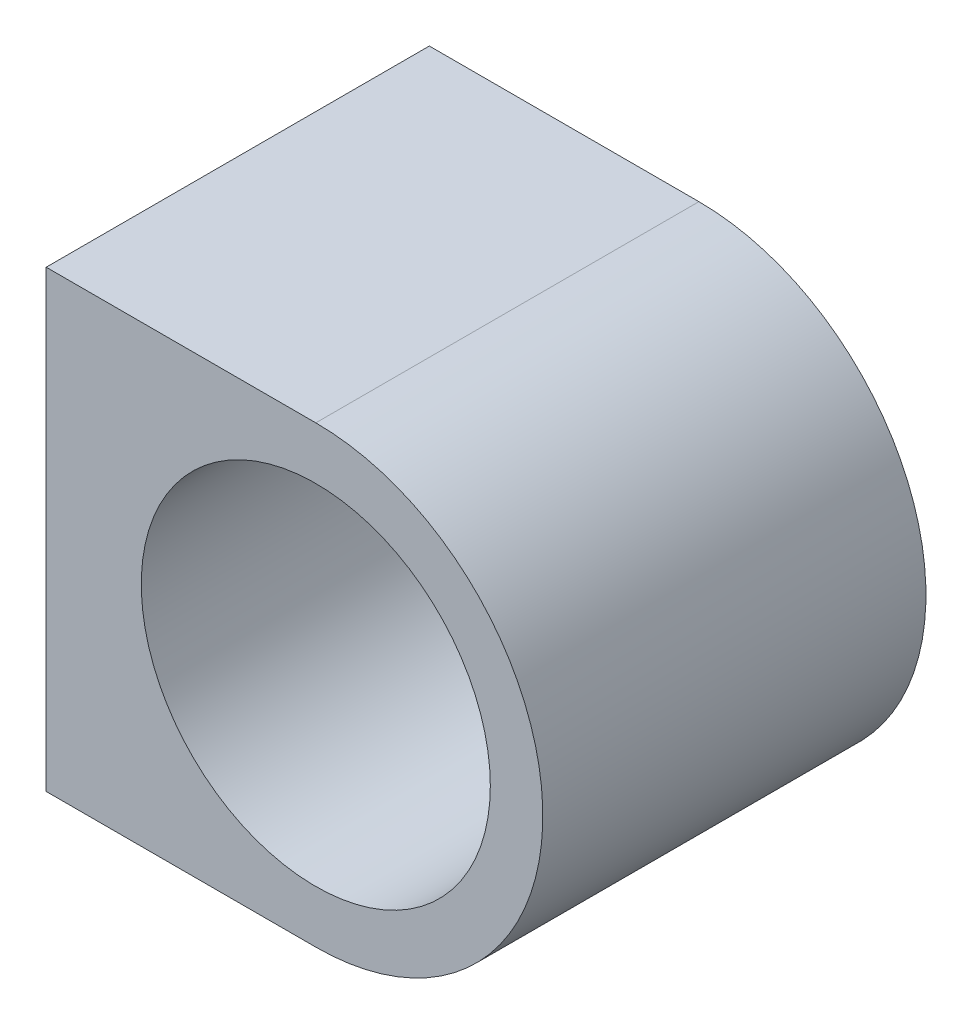
ISO-10303-21;
HEADER;
FILE_DESCRIPTION(('STEP AP214'),'2;1');
FILE_NAME('part.step','',(''),(''),'','','');
FILE_SCHEMA(('AUTOMOTIVE_DESIGN { 1 0 10303 214 1 1 1 1 }'));
ENDSEC;
DATA;
#1=APPLICATION_CONTEXT('core data for automotive mechanical design processes');
#2=APPLICATION_PROTOCOL_DEFINITION('international standard','automotive_design',2000,#1);
#3=PRODUCT_CONTEXT('',#1,'mechanical');
#4=PRODUCT('Part','Part','',(#3));
#5=PRODUCT_RELATED_PRODUCT_CATEGORY('part','',(#4));
#6=PRODUCT_DEFINITION_FORMATION('','',#4);
#7=PRODUCT_DEFINITION_CONTEXT('part definition',#1,'design');
#8=PRODUCT_DEFINITION('design','',#6,#7);
#9=PRODUCT_DEFINITION_SHAPE('','',#8);
#10=(LENGTH_UNIT() NAMED_UNIT(*) SI_UNIT(.MILLI.,.METRE.));
#11=(NAMED_UNIT(*) PLANE_ANGLE_UNIT() SI_UNIT($,.RADIAN.));
#12=(NAMED_UNIT(*) SI_UNIT($,.STERADIAN.) SOLID_ANGLE_UNIT());
#13=UNCERTAINTY_MEASURE_WITH_UNIT(LENGTH_MEASURE(1.E-05),#10,'distance_accuracy_value','');
#14=(GEOMETRIC_REPRESENTATION_CONTEXT(3) GLOBAL_UNCERTAINTY_ASSIGNED_CONTEXT((#13)) GLOBAL_UNIT_ASSIGNED_CONTEXT((#10,
#11,#12)) REPRESENTATION_CONTEXT('',''));
#15=CARTESIAN_POINT('',(0.,0.,0.));
#16=DIRECTION('',(0.,0.,1.));
#17=DIRECTION('',(1.,0.,0.));
#18=AXIS2_PLACEMENT_3D('',#15,#16,#17);
#19=CARTESIAN_POINT('',(0.,0.,13.5));
#20=DIRECTION('',(0.,0.,1.));
#21=DIRECTION('',(1.,0.,0.));
#22=AXIS2_PLACEMENT_3D('',#19,#20,#21);
#23=PLANE('',#22);
#24=CARTESIAN_POINT('',(0.,0.,13.5));
#25=DIRECTION('',(0.,0.,1.));
#26=DIRECTION('',(1.,0.,0.));
#27=AXIS2_PLACEMENT_3D('',#24,#25,#26);
#28=CIRCLE('',#27,8.);
#29=CARTESIAN_POINT('',(0.,-8.,13.5));
#30=VERTEX_POINT('',#29);
#31=CARTESIAN_POINT('',(0.,8.,13.5));
#32=VERTEX_POINT('',#31);
#33=EDGE_CURVE('E131',#30,#32,#28,.T.);
#34=ORIENTED_EDGE('',*,*,#33,.T.);
#35=DIRECTION('',(-1.,0.,0.));
#36=VECTOR('',#35,1.);
#37=CARTESIAN_POINT('',(0.,8.,13.5));
#38=LINE('',#37,#36);
#39=CARTESIAN_POINT('',(-9.5,8.,13.5));
#40=VERTEX_POINT('',#39);
#41=EDGE_CURVE('E78',#32,#40,#38,.T.);
#42=ORIENTED_EDGE('',*,*,#41,.T.);
#43=DIRECTION('',(0.,-1.,0.));
#44=VECTOR('',#43,1.);
#45=CARTESIAN_POINT('',(-9.5,8.,13.5));
#46=LINE('',#45,#44);
#47=CARTESIAN_POINT('',(-9.5,-8.,13.5));
#48=VERTEX_POINT('',#47);
#49=EDGE_CURVE('E134',#40,#48,#46,.T.);
#50=ORIENTED_EDGE('',*,*,#49,.T.);
#51=DIRECTION('',(1.,0.,0.));
#52=VECTOR('',#51,1.);
#53=CARTESIAN_POINT('',(0.,-8.,13.5));
#54=LINE('',#53,#52);
#55=EDGE_CURVE('E47',#48,#30,#54,.T.);
#56=ORIENTED_EDGE('',*,*,#55,.T.);
#57=EDGE_LOOP('',(#34,#42,#50,#56));
#58=FACE_BOUND('',#57,.T.);
#59=CARTESIAN_POINT('',(0.,0.,13.5));
#60=DIRECTION('',(0.,0.,1.));
#61=DIRECTION('',(1.,0.,0.));
#62=AXIS2_PLACEMENT_3D('',#59,#60,#61);
#63=CIRCLE('',#62,6.15);
#64=CARTESIAN_POINT('',(6.15,0.,13.5));
#65=VERTEX_POINT('',#64);
#66=EDGE_CURVE('E125',#65,#65,#63,.T.);
#67=ORIENTED_EDGE('',*,*,#66,.F.);
#68=EDGE_LOOP('',(#67));
#69=FACE_BOUND('',#68,.T.);
#70=ADVANCED_FACE('F30',(#58,#69),#23,.T.);
#71=CARTESIAN_POINT('',(0.,0.,0.));
#72=DIRECTION('',(0.,0.,1.));
#73=DIRECTION('',(1.,0.,0.));
#74=AXIS2_PLACEMENT_3D('',#71,#72,#73);
#75=PLANE('',#74);
#76=CARTESIAN_POINT('',(0.,0.,0.));
#77=DIRECTION('',(0.,0.,1.));
#78=DIRECTION('',(1.,0.,0.));
#79=AXIS2_PLACEMENT_3D('',#76,#77,#78);
#80=CIRCLE('',#79,8.);
#81=CARTESIAN_POINT('',(0.,-8.,0.));
#82=VERTEX_POINT('',#81);
#83=CARTESIAN_POINT('',(0.,8.,0.));
#84=VERTEX_POINT('',#83);
#85=EDGE_CURVE('E128',#82,#84,#80,.T.);
#86=ORIENTED_EDGE('',*,*,#85,.F.);
#87=DIRECTION('',(1.,0.,0.));
#88=VECTOR('',#87,1.);
#89=CARTESIAN_POINT('',(0.,-8.,0.));
#90=LINE('',#89,#88);
#91=CARTESIAN_POINT('',(-9.5,-8.,0.));
#92=VERTEX_POINT('',#91);
#93=EDGE_CURVE('E71',#92,#82,#90,.T.);
#94=ORIENTED_EDGE('',*,*,#93,.F.);
#95=DIRECTION('',(0.,-1.,0.));
#96=VECTOR('',#95,1.);
#97=CARTESIAN_POINT('',(-9.5,8.,0.));
#98=LINE('',#97,#96);
#99=CARTESIAN_POINT('',(-9.5,8.,0.));
#100=VERTEX_POINT('',#99);
#101=EDGE_CURVE('E65',#100,#92,#98,.T.);
#102=ORIENTED_EDGE('',*,*,#101,.F.);
#103=DIRECTION('',(-1.,0.,0.));
#104=VECTOR('',#103,1.);
#105=CARTESIAN_POINT('',(0.,8.,0.));
#106=LINE('',#105,#104);
#107=EDGE_CURVE('E140',#84,#100,#106,.T.);
#108=ORIENTED_EDGE('',*,*,#107,.F.);
#109=EDGE_LOOP('',(#86,#94,#102,#108));
#110=FACE_BOUND('',#109,.T.);
#111=CARTESIAN_POINT('',(0.,0.,0.));
#112=DIRECTION('',(0.,0.,1.));
#113=DIRECTION('',(1.,0.,0.));
#114=AXIS2_PLACEMENT_3D('',#111,#112,#113);
#115=CIRCLE('',#114,6.15);
#116=CARTESIAN_POINT('',(6.15,0.,0.));
#117=VERTEX_POINT('',#116);
#118=EDGE_CURVE('E124',#117,#117,#115,.T.);
#119=ORIENTED_EDGE('',*,*,#118,.T.);
#120=EDGE_LOOP('',(#119));
#121=FACE_BOUND('',#120,.T.);
#122=ADVANCED_FACE('F150',(#110,#121),#75,.F.);
#123=CARTESIAN_POINT('',(0.,0.,13.5));
#124=DIRECTION('',(0.,0.,-1.));
#125=DIRECTION('',(-1.,0.,0.));
#126=AXIS2_PLACEMENT_3D('',#123,#124,#125);
#127=CYLINDRICAL_SURFACE('',#126,8.);
#128=ORIENTED_EDGE('',*,*,#85,.T.);
#129=DIRECTION('',(0.,0.,-1.));
#130=VECTOR('',#129,1.);
#131=CARTESIAN_POINT('',(0.,8.,13.5));
#132=LINE('',#131,#130);
#133=EDGE_CURVE('E11',#32,#84,#132,.T.);
#134=ORIENTED_EDGE('',*,*,#133,.F.);
#135=ORIENTED_EDGE('',*,*,#33,.F.);
#136=DIRECTION('',(0.,0.,-1.));
#137=VECTOR('',#136,1.);
#138=CARTESIAN_POINT('',(0.,-8.,13.5));
#139=LINE('',#138,#137);
#140=EDGE_CURVE('E137',#30,#82,#139,.T.);
#141=ORIENTED_EDGE('',*,*,#140,.T.);
#142=EDGE_LOOP('',(#128,#134,#135,#141));
#143=FACE_BOUND('',#142,.T.);
#144=ADVANCED_FACE('F32',(#143),#127,.T.);
#145=CARTESIAN_POINT('',(0.,8.,13.5));
#146=DIRECTION('',(0.,-1.,0.));
#147=DIRECTION('',(1.,0.,0.));
#148=AXIS2_PLACEMENT_3D('',#145,#146,#147);
#149=PLANE('',#148);
#150=ORIENTED_EDGE('',*,*,#107,.T.);
#151=DIRECTION('',(0.,0.,-1.));
#152=VECTOR('',#151,1.);
#153=CARTESIAN_POINT('',(-9.5,8.,13.5));
#154=LINE('',#153,#152);
#155=EDGE_CURVE('E39',#40,#100,#154,.T.);
#156=ORIENTED_EDGE('',*,*,#155,.F.);
#157=ORIENTED_EDGE('',*,*,#41,.F.);
#158=ORIENTED_EDGE('',*,*,#133,.T.);
#159=EDGE_LOOP('',(#150,#156,#157,#158));
#160=FACE_BOUND('',#159,.T.);
#161=ADVANCED_FACE('F166',(#160),#149,.F.);
#162=CARTESIAN_POINT('',(-9.5,8.,13.5));
#163=DIRECTION('',(1.,0.,0.));
#164=DIRECTION('',(0.,0.,-1.));
#165=AXIS2_PLACEMENT_3D('',#162,#163,#164);
#166=PLANE('',#165);
#167=CARTESIAN_POINT('',(-9.5,-5.,2.5));
#168=DIRECTION('',(-1.,0.,0.));
#169=DIRECTION('',(0.,0.,1.));
#170=AXIS2_PLACEMENT_3D('',#167,#168,#169);
#171=CIRCLE('',#170,1.35);
#172=CARTESIAN_POINT('',(-9.5,-5.,3.85));
#173=VERTEX_POINT('',#172);
#174=EDGE_CURVE('E102',#173,#173,#171,.T.);
#175=ORIENTED_EDGE('',*,*,#174,.F.);
#176=EDGE_LOOP('',(#175));
#177=FACE_BOUND('',#176,.T.);
#178=CARTESIAN_POINT('',(-9.5,5.,2.5));
#179=DIRECTION('',(-1.,0.,0.));
#180=DIRECTION('',(0.,0.,1.));
#181=AXIS2_PLACEMENT_3D('',#178,#179,#180);
#182=CIRCLE('',#181,1.35);
#183=CARTESIAN_POINT('',(-9.5,5.,3.85));
#184=VERTEX_POINT('',#183);
#185=EDGE_CURVE('E101',#184,#184,#182,.T.);
#186=ORIENTED_EDGE('',*,*,#185,.F.);
#187=EDGE_LOOP('',(#186));
#188=FACE_BOUND('',#187,.T.);
#189=CARTESIAN_POINT('',(-9.5,5.,11.));
#190=DIRECTION('',(-1.,0.,0.));
#191=DIRECTION('',(0.,0.,1.));
#192=AXIS2_PLACEMENT_3D('',#189,#190,#191);
#193=CIRCLE('',#192,1.35);
#194=CARTESIAN_POINT('',(-9.5,5.,12.35));
#195=VERTEX_POINT('',#194);
#196=EDGE_CURVE('E112',#195,#195,#193,.T.);
#197=ORIENTED_EDGE('',*,*,#196,.F.);
#198=EDGE_LOOP('',(#197));
#199=FACE_BOUND('',#198,.T.);
#200=CARTESIAN_POINT('',(-9.5,-5.,11.));
#201=DIRECTION('',(-1.,0.,0.));
#202=DIRECTION('',(0.,0.,1.));
#203=AXIS2_PLACEMENT_3D('',#200,#201,#202);
#204=CIRCLE('',#203,1.35);
#205=CARTESIAN_POINT('',(-9.5,-5.,12.35));
#206=VERTEX_POINT('',#205);
#207=EDGE_CURVE('E118',#206,#206,#204,.T.);
#208=ORIENTED_EDGE('',*,*,#207,.F.);
#209=EDGE_LOOP('',(#208));
#210=FACE_BOUND('',#209,.T.);
#211=ORIENTED_EDGE('',*,*,#101,.T.);
#212=DIRECTION('',(0.,0.,-1.));
#213=VECTOR('',#212,1.);
#214=CARTESIAN_POINT('',(-9.5,-8.,13.5));
#215=LINE('',#214,#213);
#216=EDGE_CURVE('E145',#48,#92,#215,.T.);
#217=ORIENTED_EDGE('',*,*,#216,.F.);
#218=ORIENTED_EDGE('',*,*,#49,.F.);
#219=ORIENTED_EDGE('',*,*,#155,.T.);
#220=EDGE_LOOP('',(#211,#217,#218,#219));
#221=FACE_BOUND('',#220,.T.);
#222=ADVANCED_FACE('F147',(#177,#188,#199,#210,#221),#166,.F.);
#223=CARTESIAN_POINT('',(0.,-8.,13.5));
#224=DIRECTION('',(0.,1.,0.));
#225=DIRECTION('',(-1.,0.,0.));
#226=AXIS2_PLACEMENT_3D('',#223,#224,#225);
#227=PLANE('',#226);
#228=ORIENTED_EDGE('',*,*,#93,.T.);
#229=ORIENTED_EDGE('',*,*,#140,.F.);
#230=ORIENTED_EDGE('',*,*,#55,.F.);
#231=ORIENTED_EDGE('',*,*,#216,.T.);
#232=EDGE_LOOP('',(#228,#229,#230,#231));
#233=FACE_BOUND('',#232,.T.);
#234=ADVANCED_FACE('F155',(#233),#227,.F.);
#235=CARTESIAN_POINT('',(0.,0.,13.5));
#236=DIRECTION('',(0.,0.,-1.));
#237=DIRECTION('',(-1.,0.,0.));
#238=AXIS2_PLACEMENT_3D('',#235,#236,#237);
#239=CYLINDRICAL_SURFACE('',#238,6.15);
#240=ORIENTED_EDGE('',*,*,#66,.T.);
#241=EDGE_LOOP('',(#240));
#242=FACE_BOUND('',#241,.T.);
#243=ORIENTED_EDGE('',*,*,#118,.F.);
#244=EDGE_LOOP('',(#243));
#245=FACE_BOUND('',#244,.T.);
#246=ADVANCED_FACE('F157',(#242,#245),#239,.F.);
#247=CARTESIAN_POINT('',(-5.5,-5.,11.));
#248=DIRECTION('',(-1.,0.,0.));
#249=DIRECTION('',(0.,0.,1.));
#250=AXIS2_PLACEMENT_3D('',#247,#248,#249);
#251=CONICAL_SURFACE('',#250,1.35,1.02974425867665);
#252=CARTESIAN_POINT('',(-4.68883816431279,-5.,11.));
#253=VERTEX_POINT('',#252);
#254=VERTEX_LOOP('',#253);
#255=FACE_BOUND('',#254,.T.);
#256=CARTESIAN_POINT('',(-5.5,-5.,11.));
#257=DIRECTION('',(-1.,0.,0.));
#258=DIRECTION('',(0.,0.,1.));
#259=AXIS2_PLACEMENT_3D('',#256,#257,#258);
#260=CIRCLE('',#259,1.35);
#261=CARTESIAN_POINT('',(-5.5,-5.,12.35));
#262=VERTEX_POINT('',#261);
#263=EDGE_CURVE('E121',#262,#262,#260,.T.);
#264=ORIENTED_EDGE('',*,*,#263,.T.);
#265=EDGE_LOOP('',(#264));
#266=FACE_BOUND('',#265,.T.);
#267=ADVANCED_FACE('F163',(#255,#266),#251,.F.);
#268=CARTESIAN_POINT('',(-9.5,-5.,11.));
#269=DIRECTION('',(-1.,0.,0.));
#270=DIRECTION('',(0.,0.,1.));
#271=AXIS2_PLACEMENT_3D('',#268,#269,#270);
#272=CYLINDRICAL_SURFACE('',#271,1.35);
#273=ORIENTED_EDGE('',*,*,#263,.F.);
#274=EDGE_LOOP('',(#273));
#275=FACE_BOUND('',#274,.T.);
#276=ORIENTED_EDGE('',*,*,#207,.T.);
#277=EDGE_LOOP('',(#276));
#278=FACE_BOUND('',#277,.T.);
#279=ADVANCED_FACE('F179',(#275,#278),#272,.F.);
#280=CARTESIAN_POINT('',(-5.5,5.,11.));
#281=DIRECTION('',(-1.,0.,0.));
#282=DIRECTION('',(0.,0.,1.));
#283=AXIS2_PLACEMENT_3D('',#280,#281,#282);
#284=CONICAL_SURFACE('',#283,1.35,1.02974425867665);
#285=CARTESIAN_POINT('',(-4.68883816431279,5.,11.));
#286=VERTEX_POINT('',#285);
#287=VERTEX_LOOP('',#286);
#288=FACE_BOUND('',#287,.T.);
#289=CARTESIAN_POINT('',(-5.5,5.,11.));
#290=DIRECTION('',(-1.,0.,0.));
#291=DIRECTION('',(0.,0.,1.));
#292=AXIS2_PLACEMENT_3D('',#289,#290,#291);
#293=CIRCLE('',#292,1.35);
#294=CARTESIAN_POINT('',(-5.5,5.,12.35));
#295=VERTEX_POINT('',#294);
#296=EDGE_CURVE('E115',#295,#295,#293,.T.);
#297=ORIENTED_EDGE('',*,*,#296,.T.);
#298=EDGE_LOOP('',(#297));
#299=FACE_BOUND('',#298,.T.);
#300=ADVANCED_FACE('F183',(#288,#299),#284,.F.);
#301=CARTESIAN_POINT('',(-9.5,5.,11.));
#302=DIRECTION('',(-1.,0.,0.));
#303=DIRECTION('',(0.,0.,1.));
#304=AXIS2_PLACEMENT_3D('',#301,#302,#303);
#305=CYLINDRICAL_SURFACE('',#304,1.35);
#306=ORIENTED_EDGE('',*,*,#296,.F.);
#307=EDGE_LOOP('',(#306));
#308=FACE_BOUND('',#307,.T.);
#309=ORIENTED_EDGE('',*,*,#196,.T.);
#310=EDGE_LOOP('',(#309));
#311=FACE_BOUND('',#310,.T.);
#312=ADVANCED_FACE('F187',(#308,#311),#305,.F.);
#313=CARTESIAN_POINT('',(-5.5,5.,2.5));
#314=DIRECTION('',(-1.,0.,0.));
#315=DIRECTION('',(0.,0.,1.));
#316=AXIS2_PLACEMENT_3D('',#313,#314,#315);
#317=CONICAL_SURFACE('',#316,1.35,1.02974425867665);
#318=CARTESIAN_POINT('',(-4.68883816431279,5.,2.5));
#319=VERTEX_POINT('',#318);
#320=VERTEX_LOOP('',#319);
#321=FACE_BOUND('',#320,.T.);
#322=CARTESIAN_POINT('',(-5.5,5.,2.5));
#323=DIRECTION('',(-1.,0.,0.));
#324=DIRECTION('',(0.,0.,1.));
#325=AXIS2_PLACEMENT_3D('',#322,#323,#324);
#326=CIRCLE('',#325,1.35);
#327=CARTESIAN_POINT('',(-5.5,5.,3.85));
#328=VERTEX_POINT('',#327);
#329=EDGE_CURVE('E105',#328,#328,#326,.T.);
#330=ORIENTED_EDGE('',*,*,#329,.T.);
#331=EDGE_LOOP('',(#330));
#332=FACE_BOUND('',#331,.T.);
#333=ADVANCED_FACE('F191',(#321,#332),#317,.F.);
#334=CARTESIAN_POINT('',(-9.5,5.,2.5));
#335=DIRECTION('',(-1.,0.,0.));
#336=DIRECTION('',(0.,0.,1.));
#337=AXIS2_PLACEMENT_3D('',#334,#335,#336);
#338=CYLINDRICAL_SURFACE('',#337,1.35);
#339=ORIENTED_EDGE('',*,*,#329,.F.);
#340=EDGE_LOOP('',(#339));
#341=FACE_BOUND('',#340,.T.);
#342=ORIENTED_EDGE('',*,*,#185,.T.);
#343=EDGE_LOOP('',(#342));
#344=FACE_BOUND('',#343,.T.);
#345=ADVANCED_FACE('F95',(#341,#344),#338,.F.);
#346=CARTESIAN_POINT('',(-5.5,-5.,2.5));
#347=DIRECTION('',(-1.,0.,0.));
#348=DIRECTION('',(0.,0.,1.));
#349=AXIS2_PLACEMENT_3D('',#346,#347,#348);
#350=CONICAL_SURFACE('',#349,1.35,1.02974425867665);
#351=CARTESIAN_POINT('',(-4.68883816431279,-5.,2.5));
#352=VERTEX_POINT('',#351);
#353=VERTEX_LOOP('',#352);
#354=FACE_BOUND('',#353,.T.);
#355=CARTESIAN_POINT('',(-5.5,-5.,2.5));
#356=DIRECTION('',(-1.,0.,0.));
#357=DIRECTION('',(0.,0.,1.));
#358=AXIS2_PLACEMENT_3D('',#355,#356,#357);
#359=CIRCLE('',#358,1.35);
#360=CARTESIAN_POINT('',(-5.5,-5.,3.85));
#361=VERTEX_POINT('',#360);
#362=EDGE_CURVE('E99',#361,#361,#359,.T.);
#363=ORIENTED_EDGE('',*,*,#362,.T.);
#364=EDGE_LOOP('',(#363));
#365=FACE_BOUND('',#364,.T.);
#366=ADVANCED_FACE('F91',(#354,#365),#350,.F.);
#367=CARTESIAN_POINT('',(-9.5,-5.,2.5));
#368=DIRECTION('',(-1.,0.,0.));
#369=DIRECTION('',(0.,0.,1.));
#370=AXIS2_PLACEMENT_3D('',#367,#368,#369);
#371=CYLINDRICAL_SURFACE('',#370,1.35);
#372=ORIENTED_EDGE('',*,*,#362,.F.);
#373=EDGE_LOOP('',(#372));
#374=FACE_BOUND('',#373,.T.);
#375=ORIENTED_EDGE('',*,*,#174,.T.);
#376=EDGE_LOOP('',(#375));
#377=FACE_BOUND('',#376,.T.);
#378=ADVANCED_FACE('F94',(#374,#377),#371,.F.);
#379=CLOSED_SHELL('',(#70,#122,#144,#161,#222,#234,#246,#267,#279,#300,#312,#333,#345,#366,#378));
#380=MANIFOLD_SOLID_BREP('B2',#379);
#381=ADVANCED_BREP_SHAPE_REPRESENTATION('',(#18,#380),#14);
#382=SHAPE_DEFINITION_REPRESENTATION(#9,#381);
ENDSEC;
END-ISO-10303-21;
